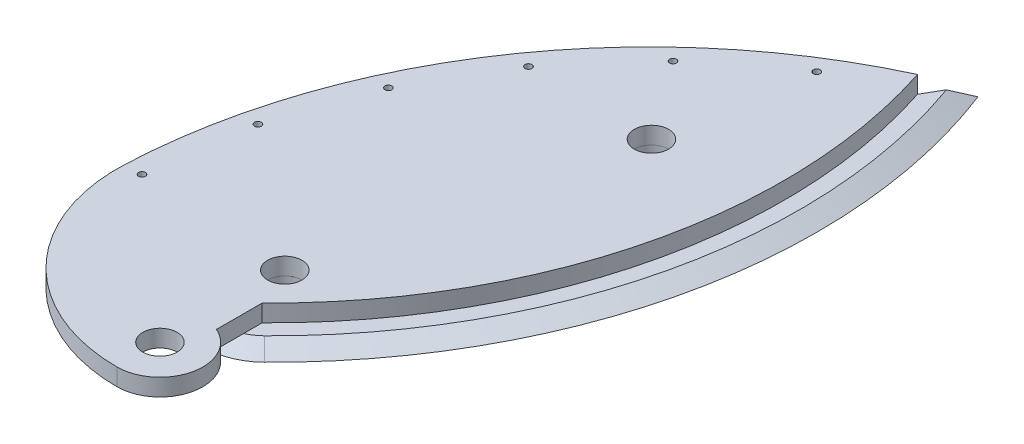
ISO-10303-21;
HEADER;
FILE_DESCRIPTION(('STEP AP214'),'2;1');
FILE_NAME('part.step','',(''),(''),'','','');
FILE_SCHEMA(('AUTOMOTIVE_DESIGN { 1 0 10303 214 1 1 1 1 }'));
ENDSEC;
DATA;
#1=APPLICATION_CONTEXT('core data for automotive mechanical design processes');
#2=APPLICATION_PROTOCOL_DEFINITION('international standard','automotive_design',2000,#1);
#3=PRODUCT_CONTEXT('',#1,'mechanical');
#4=PRODUCT('Part','Part','',(#3));
#5=PRODUCT_RELATED_PRODUCT_CATEGORY('part','',(#4));
#6=PRODUCT_DEFINITION_FORMATION('','',#4);
#7=PRODUCT_DEFINITION_CONTEXT('part definition',#1,'design');
#8=PRODUCT_DEFINITION('design','',#6,#7);
#9=PRODUCT_DEFINITION_SHAPE('','',#8);
#10=(LENGTH_UNIT() NAMED_UNIT(*) SI_UNIT(.MILLI.,.METRE.));
#11=(NAMED_UNIT(*) PLANE_ANGLE_UNIT() SI_UNIT($,.RADIAN.));
#12=(NAMED_UNIT(*) SI_UNIT($,.STERADIAN.) SOLID_ANGLE_UNIT());
#13=UNCERTAINTY_MEASURE_WITH_UNIT(LENGTH_MEASURE(1.E-05),#10,'distance_accuracy_value','');
#14=(GEOMETRIC_REPRESENTATION_CONTEXT(3) GLOBAL_UNCERTAINTY_ASSIGNED_CONTEXT((#13)) GLOBAL_UNIT_ASSIGNED_CONTEXT((#10,
#11,#12)) REPRESENTATION_CONTEXT('',''));
#15=CARTESIAN_POINT('',(0.,0.,0.));
#16=DIRECTION('',(0.,0.,1.));
#17=DIRECTION('',(1.,0.,0.));
#18=AXIS2_PLACEMENT_3D('',#15,#16,#17);
#19=CARTESIAN_POINT('',(0.,-3.,-36.3607275050168));
#20=DIRECTION('',(0.,1.,0.));
#21=DIRECTION('',(0.,0.,1.));
#22=AXIS2_PLACEMENT_3D('',#19,#20,#21);
#23=CYLINDRICAL_SURFACE('',#22,5.00000000000001);
#24=CARTESIAN_POINT('',(0.,-3.,-36.3607275050168));
#25=DIRECTION('',(0.,-1.,0.));
#26=DIRECTION('',(0.,0.,-1.));
#27=AXIS2_PLACEMENT_3D('',#24,#25,#26);
#28=CIRCLE('',#27,5.00000000000001);
#29=CARTESIAN_POINT('',(0.,-3.,-41.3607275050168));
#30=VERTEX_POINT('',#29);
#31=EDGE_CURVE('E121',#30,#30,#28,.F.);
#32=ORIENTED_EDGE('',*,*,#31,.F.);
#33=EDGE_LOOP('',(#32));
#34=FACE_BOUND('',#33,.T.);
#35=CARTESIAN_POINT('',(0.,0.,-36.3607275050168));
#36=DIRECTION('',(0.,-1.,0.));
#37=DIRECTION('',(0.,0.,-1.));
#38=AXIS2_PLACEMENT_3D('',#35,#36,#37);
#39=CIRCLE('',#38,5.00000000000001);
#40=CARTESIAN_POINT('',(0.,0.,-41.3607275050168));
#41=VERTEX_POINT('',#40);
#42=EDGE_CURVE('E129',#41,#41,#39,.F.);
#43=ORIENTED_EDGE('',*,*,#42,.T.);
#44=EDGE_LOOP('',(#43));
#45=FACE_BOUND('',#44,.T.);
#46=ADVANCED_FACE('F53',(#34,#45),#23,.F.);
#47=CARTESIAN_POINT('',(-44.9336347304744,-3.,-25.9424461073077));
#48=DIRECTION('',(-0.866025403784438,0.,-0.5));
#49=DIRECTION('',(-0.5,0.,0.866025403784439));
#50=AXIS2_PLACEMENT_3D('',#47,#48,#49);
#51=PLANE('',#50);
#52=DIRECTION('',(-0.5,0.,0.866025403784439));
#53=VECTOR('',#52,1.);
#54=CARTESIAN_POINT('',(-44.9336347304744,-3.,-25.9424461073077));
#55=LINE('',#54,#53);
#56=CARTESIAN_POINT('',(49.239635027576,-3.,-189.055334043141));
#57=VERTEX_POINT('',#56);
#58=CARTESIAN_POINT('',(-17.5,-3.,-73.4588952967756));
#59=VERTEX_POINT('',#58);
#60=EDGE_CURVE('E103',#57,#59,#55,.T.);
#61=ORIENTED_EDGE('',*,*,#60,.T.);
#62=DIRECTION('',(-0.480384461415261,-0.277350098112616,0.832050294337843));
#63=VECTOR('',#62,1.);
#64=CARTESIAN_POINT('',(-42.8233551358225,-17.6204459044517,-29.5975575834207));
#65=LINE('',#64,#63);
#66=CARTESIAN_POINT('',(-12.3038475772934,0.,-82.4588952967754));
#67=VERTEX_POINT('',#66);
#68=EDGE_CURVE('E140',#59,#67,#65,.F.);
#69=ORIENTED_EDGE('',*,*,#68,.T.);
#70=DIRECTION('',(-0.5,0.,0.866025403784439));
#71=VECTOR('',#70,1.);
#72=CARTESIAN_POINT('',(-44.9336347304744,0.,-25.9424461073077));
#73=LINE('',#72,#71);
#74=CARTESIAN_POINT('',(45.8658636185588,0.,-183.2117905496));
#75=VERTEX_POINT('',#74);
#76=EDGE_CURVE('E111',#75,#67,#73,.T.);
#77=ORIENTED_EDGE('',*,*,#76,.F.);
#78=CARTESIAN_POINT('',(45.8658636185588,0.,-183.2117905496));
#79=CARTESIAN_POINT('',(46.1475489587695,-0.247575260421279,-183.699683870592));
#80=CARTESIAN_POINT('',(46.4290959300721,-0.495780041105459,-184.187337529605));
#81=CARTESIAN_POINT('',(46.9919180548333,-0.993412526245764,-185.162174045315));
#82=CARTESIAN_POINT('',(47.273193209503,-1.24284022522252,-185.64935690411));
#83=CARTESIAN_POINT('',(47.8354790835258,-1.74288459465934,-186.623264606296));
#84=CARTESIAN_POINT('',(48.1164898029345,-1.9935012648688,-187.109989449783));
#85=CARTESIAN_POINT('',(48.6782540967055,-2.49589152411125,-188.082993748473));
#86=CARTESIAN_POINT('',(48.959007669911,-2.74766511831811,-188.569273201671));
#87=CARTESIAN_POINT('',(49.239635027576,-2.99999999999994,-189.055334043141));
#88=B_SPLINE_CURVE_WITH_KNOTS('',3,(#78,#79,#80,#81,#82,#83,#84,#85,#86,#87),.UNSPECIFIED.,.F.,
.F.,(4,2,2,2,4),(0.,1.84610899661148,3.69220972915079,5.53831007261421,7.38441868006475),.UNSPECIFIED.);
#89=EDGE_CURVE('E127',#75,#57,#88,.T.);
#90=ORIENTED_EDGE('',*,*,#89,.T.);
#91=EDGE_LOOP('',(#61,#69,#77,#90));
#92=FACE_BOUND('',#91,.T.);
#93=ADVANCED_FACE('F142',(#92),#51,.T.);
#94=CARTESIAN_POINT('',(20.3781666838312,-3.,-122.796020061503));
#95=DIRECTION('',(0.,1.,0.));
#96=DIRECTION('',(0.,0.,1.));
#97=AXIS2_PLACEMENT_3D('',#94,#95,#96);
#98=CYLINDRICAL_SURFACE('',#97,4.99999999999996);
#99=CARTESIAN_POINT('',(20.3781666838312,-3.,-122.796020061503));
#100=DIRECTION('',(0.,-1.,0.));
#101=DIRECTION('',(0.,0.,-1.));
#102=AXIS2_PLACEMENT_3D('',#99,#100,#101);
#103=CIRCLE('',#102,4.99999999999996);
#104=CARTESIAN_POINT('',(20.3781666838312,-3.,-127.796020061503));
#105=VERTEX_POINT('',#104);
#106=EDGE_CURVE('E124',#105,#105,#103,.F.);
#107=ORIENTED_EDGE('',*,*,#106,.F.);
#108=EDGE_LOOP('',(#107));
#109=FACE_BOUND('',#108,.T.);
#110=CARTESIAN_POINT('',(20.3781666838312,0.,-122.796020061503));
#111=DIRECTION('',(0.,-1.,0.));
#112=DIRECTION('',(0.,0.,-1.));
#113=AXIS2_PLACEMENT_3D('',#110,#111,#112);
#114=CIRCLE('',#113,4.99999999999996);
#115=CARTESIAN_POINT('',(20.3781666838312,0.,-127.796020061503));
#116=VERTEX_POINT('',#115);
#117=EDGE_CURVE('E106',#116,#116,#114,.F.);
#118=ORIENTED_EDGE('',*,*,#117,.T.);
#119=EDGE_LOOP('',(#118));
#120=FACE_BOUND('',#119,.T.);
#121=ADVANCED_FACE('F147',(#109,#120),#98,.F.);
#122=CARTESIAN_POINT('',(0.,-3.,0.));
#123=DIRECTION('',(0.,-1.,0.));
#124=DIRECTION('',(0.,0.,-1.));
#125=AXIS2_PLACEMENT_3D('',#122,#123,#124);
#126=PLANE('',#125);
#127=CARTESIAN_POINT('',(-99.0854388776051,-3.,-131.693438588004));
#128=DIRECTION('',(0.,-1.,0.));
#129=DIRECTION('',(0.,0.,-1.));
#130=AXIS2_PLACEMENT_3D('',#127,#128,#129);
#131=CIRCLE('',#130,159.030546119868);
#132=CARTESIAN_POINT('',(12.2517380727797,-3.,-18.1383963049683));
#133=VERTEX_POINT('',#132);
#134=EDGE_CURVE('E94',#133,#57,#131,.F.);
#135=ORIENTED_EDGE('',*,*,#134,.F.);
#136=CARTESIAN_POINT('',(0.,-3.,-30.6341921658169));
#137=DIRECTION('',(0.,-1.,0.));
#138=DIRECTION('',(0.,0.,-1.));
#139=AXIS2_PLACEMENT_3D('',#136,#137,#138);
#140=CIRCLE('',#139,17.5);
#141=CARTESIAN_POINT('',(-17.5,-3.,-30.6341921658169));
#142=VERTEX_POINT('',#141);
#143=EDGE_CURVE('E100',#133,#142,#140,.T.);
#144=ORIENTED_EDGE('',*,*,#143,.T.);
#145=DIRECTION('',(0.,0.,-1.));
#146=VECTOR('',#145,1.);
#147=CARTESIAN_POINT('',(-17.5,-3.,0.));
#148=LINE('',#147,#146);
#149=EDGE_CURVE('E116',#142,#59,#148,.T.);
#150=ORIENTED_EDGE('',*,*,#149,.T.);
#151=ORIENTED_EDGE('',*,*,#60,.F.);
#152=EDGE_LOOP('',(#135,#144,#150,#151));
#153=FACE_BOUND('',#152,.T.);
#154=ORIENTED_EDGE('',*,*,#31,.T.);
#155=EDGE_LOOP('',(#154));
#156=FACE_BOUND('',#155,.T.);
#157=ORIENTED_EDGE('',*,*,#106,.T.);
#158=EDGE_LOOP('',(#157));
#159=FACE_BOUND('',#158,.T.);
#160=ADVANCED_FACE('F96',(#153,#156,#159),#126,.T.);
#161=CARTESIAN_POINT('',(0.,0.,0.));
#162=DIRECTION('',(0.,-1.,0.));
#163=DIRECTION('',(0.,0.,-1.));
#164=AXIS2_PLACEMENT_3D('',#161,#162,#163);
#165=PLANE('',#164);
#166=ORIENTED_EDGE('',*,*,#76,.T.);
#167=DIRECTION('',(0.,0.,1.));
#168=VECTOR('',#167,1.);
#169=CARTESIAN_POINT('',(-12.3038475772935,0.,0.));
#170=LINE('',#169,#168);
#171=CARTESIAN_POINT('',(-12.3038475772935,0.,-30.6341921658169));
#172=VERTEX_POINT('',#171);
#173=EDGE_CURVE('E12',#67,#172,#170,.T.);
#174=ORIENTED_EDGE('',*,*,#173,.T.);
#175=CARTESIAN_POINT('',(0.,0.,-30.6341921658169));
#176=DIRECTION('',(0.,-1.,0.));
#177=DIRECTION('',(0.,0.,-1.));
#178=AXIS2_PLACEMENT_3D('',#175,#176,#177);
#179=CIRCLE('',#178,12.3038475772935);
#180=CARTESIAN_POINT('',(8.61391530310883,0.,-21.848685444168));
#181=VERTEX_POINT('',#180);
#182=EDGE_CURVE('E64',#172,#181,#179,.F.);
#183=ORIENTED_EDGE('',*,*,#182,.T.);
#184=CARTESIAN_POINT('',(-99.0854388776051,0.,-131.693438588004));
#185=DIRECTION('',(0.,-1.,0.));
#186=DIRECTION('',(0.,0.,-1.));
#187=AXIS2_PLACEMENT_3D('',#184,#185,#186);
#188=CIRCLE('',#187,153.834393697161);
#189=EDGE_CURVE('E109',#181,#75,#188,.F.);
#190=ORIENTED_EDGE('',*,*,#189,.T.);
#191=EDGE_LOOP('',(#166,#174,#183,#190));
#192=FACE_BOUND('',#191,.T.);
#193=ORIENTED_EDGE('',*,*,#42,.F.);
#194=EDGE_LOOP('',(#193));
#195=FACE_BOUND('',#194,.T.);
#196=ORIENTED_EDGE('',*,*,#117,.F.);
#197=EDGE_LOOP('',(#196));
#198=FACE_BOUND('',#197,.T.);
#199=ADVANCED_FACE('F163',(#192,#195,#198),#165,.F.);
#200=CARTESIAN_POINT('',(-99.0854388776051,0.,-131.693438588004));
#201=DIRECTION('',(0.,-1.,0.));
#202=DIRECTION('',(0.,0.,-1.));
#203=AXIS2_PLACEMENT_3D('',#200,#201,#202);
#204=CONICAL_SURFACE('',#203,153.834393697161,1.0471975511966);
#205=ORIENTED_EDGE('',*,*,#89,.F.);
#206=ORIENTED_EDGE('',*,*,#189,.F.);
#207=DIRECTION('',(-0.606303794945155,0.500000000000001,-0.61838152319996));
#208=VECTOR('',#207,1.);
#209=CARTESIAN_POINT('',(12.2517380727797,-2.99999999999996,-18.1383963049683));
#210=LINE('',#209,#208);
#211=EDGE_CURVE('E59',#133,#181,#210,.T.);
#212=ORIENTED_EDGE('',*,*,#211,.F.);
#213=ORIENTED_EDGE('',*,*,#134,.T.);
#214=EDGE_LOOP('',(#205,#206,#212,#213));
#215=FACE_BOUND('',#214,.T.);
#216=ADVANCED_FACE('F56',(#215),#204,.T.);
#217=CARTESIAN_POINT('',(0.,-2.99999999999996,-30.6341921658169));
#218=DIRECTION('',(0.,-1.,0.));
#219=DIRECTION('',(0.,0.,-1.));
#220=AXIS2_PLACEMENT_3D('',#217,#218,#219);
#221=CONICAL_SURFACE('',#220,17.5,1.0471975511966);
#222=ORIENTED_EDGE('',*,*,#211,.T.);
#223=ORIENTED_EDGE('',*,*,#182,.F.);
#224=DIRECTION('',(0.866025403784438,0.500000000000002,0.));
#225=VECTOR('',#224,1.);
#226=CARTESIAN_POINT('',(-17.5,-2.99999999999996,-30.6341921658169));
#227=LINE('',#226,#225);
#228=EDGE_CURVE('E112',#142,#172,#227,.T.);
#229=ORIENTED_EDGE('',*,*,#228,.F.);
#230=ORIENTED_EDGE('',*,*,#143,.F.);
#231=EDGE_LOOP('',(#222,#223,#229,#230));
#232=FACE_BOUND('',#231,.T.);
#233=ADVANCED_FACE('F113',(#232),#221,.T.);
#234=CARTESIAN_POINT('',(-17.5,-2.99999999999996,0.));
#235=DIRECTION('',(0.500000000000002,-0.866025403784438,0.));
#236=DIRECTION('',(0.,0.,-1.));
#237=AXIS2_PLACEMENT_3D('',#234,#235,#236);
#238=PLANE('',#237);
#239=ORIENTED_EDGE('',*,*,#228,.T.);
#240=ORIENTED_EDGE('',*,*,#173,.F.);
#241=ORIENTED_EDGE('',*,*,#68,.F.);
#242=ORIENTED_EDGE('',*,*,#149,.F.);
#243=EDGE_LOOP('',(#239,#240,#241,#242));
#244=FACE_BOUND('',#243,.T.);
#245=ADVANCED_FACE('F151',(#244),#238,.F.);
#246=CLOSED_SHELL('',(#46,#93,#121,#160,#199,#216,#233,#245));
#247=MANIFOLD_SOLID_BREP('B2',#246);
#248=CARTESIAN_POINT('',(109.8923327433,5.,-32.6342827624353));
#249=DIRECTION('',(0.,-1.,0.));
#250=DIRECTION('',(0.,0.,-1.));
#251=AXIS2_PLACEMENT_3D('',#248,#249,#250);
#252=CYLINDRICAL_SURFACE('',#251,160.);
#253=CARTESIAN_POINT('',(109.8923327433,0.,-32.6342827624353));
#254=DIRECTION('',(0.,1.,0.));
#255=DIRECTION('',(0.,0.,1.));
#256=AXIS2_PLACEMENT_3D('',#253,#254,#255);
#257=CIRCLE('',#256,160.);
#258=CARTESIAN_POINT('',(42.7892608894871,0.,-177.882958308142));
#259=VERTEX_POINT('',#258);
#260=CARTESIAN_POINT('',(-49.9510603378634,0.,-39.7116896534385));
#261=VERTEX_POINT('',#260);
#262=EDGE_CURVE('E359',#259,#261,#257,.T.);
#263=ORIENTED_EDGE('',*,*,#262,.T.);
#264=DIRECTION('',(0.,-1.,0.));
#265=VECTOR('',#264,1.);
#266=CARTESIAN_POINT('',(-49.9510603378634,5.,-39.7116896534385));
#267=LINE('',#266,#265);
#268=CARTESIAN_POINT('',(-49.9510603378634,5.,-39.7116896534385));
#269=VERTEX_POINT('',#268);
#270=EDGE_CURVE('E51',#269,#261,#267,.T.);
#271=ORIENTED_EDGE('',*,*,#270,.F.);
#272=CARTESIAN_POINT('',(109.8923327433,5.,-32.6342827624353));
#273=DIRECTION('',(0.,1.,0.));
#274=DIRECTION('',(0.,0.,1.));
#275=AXIS2_PLACEMENT_3D('',#272,#273,#274);
#276=CIRCLE('',#275,160.);
#277=CARTESIAN_POINT('',(42.7892608894871,5.,-177.882958308142));
#278=VERTEX_POINT('',#277);
#279=EDGE_CURVE('E629',#278,#269,#276,.T.);
#280=ORIENTED_EDGE('',*,*,#279,.F.);
#281=DIRECTION('',(0.,-1.,0.));
#282=VECTOR('',#281,1.);
#283=CARTESIAN_POINT('',(42.7892608894871,5.,-177.882958308142));
#284=LINE('',#283,#282);
#285=EDGE_CURVE('E290',#278,#259,#284,.T.);
#286=ORIENTED_EDGE('',*,*,#285,.T.);
#287=EDGE_LOOP('',(#263,#271,#280,#286));
#288=FACE_BOUND('',#287,.T.);
#289=ADVANCED_FACE('F271',(#288),#252,.T.);
#290=CARTESIAN_POINT('',(0.,5.,-37.5));
#291=DIRECTION('',(0.,-1.,0.));
#292=DIRECTION('',(0.,0.,-1.));
#293=AXIS2_PLACEMENT_3D('',#290,#291,#292);
#294=CYLINDRICAL_SURFACE('',#293,50.);
#295=CARTESIAN_POINT('',(0.,0.,-37.5));
#296=DIRECTION('',(0.,1.,0.));
#297=DIRECTION('',(0.,0.,1.));
#298=AXIS2_PLACEMENT_3D('',#295,#296,#297);
#299=CIRCLE('',#298,50.);
#300=CARTESIAN_POINT('',(0.,0.,12.5));
#301=VERTEX_POINT('',#300);
#302=EDGE_CURVE('E361',#261,#301,#299,.T.);
#303=ORIENTED_EDGE('',*,*,#302,.T.);
#304=DIRECTION('',(0.,-1.,0.));
#305=VECTOR('',#304,1.);
#306=CARTESIAN_POINT('',(0.,5.,12.5));
#307=LINE('',#306,#305);
#308=CARTESIAN_POINT('',(0.,5.,12.5));
#309=VERTEX_POINT('',#308);
#310=EDGE_CURVE('E281',#309,#301,#307,.T.);
#311=ORIENTED_EDGE('',*,*,#310,.F.);
#312=CARTESIAN_POINT('',(0.,5.,-37.5));
#313=DIRECTION('',(0.,1.,0.));
#314=DIRECTION('',(0.,0.,1.));
#315=AXIS2_PLACEMENT_3D('',#312,#313,#314);
#316=CIRCLE('',#315,50.);
#317=EDGE_CURVE('E319',#269,#309,#316,.T.);
#318=ORIENTED_EDGE('',*,*,#317,.F.);
#319=ORIENTED_EDGE('',*,*,#270,.T.);
#320=EDGE_LOOP('',(#303,#311,#318,#319));
#321=FACE_BOUND('',#320,.T.);
#322=ADVANCED_FACE('F410',(#321),#294,.T.);
#323=CARTESIAN_POINT('',(0.,5.,0.));
#324=DIRECTION('',(0.,-1.,0.));
#325=DIRECTION('',(0.,0.,-1.));
#326=AXIS2_PLACEMENT_3D('',#323,#324,#325);
#327=CYLINDRICAL_SURFACE('',#326,12.5);
#328=CARTESIAN_POINT('',(0.,0.,0.));
#329=DIRECTION('',(0.,1.,0.));
#330=DIRECTION('',(0.,0.,1.));
#331=AXIS2_PLACEMENT_3D('',#328,#329,#330);
#332=CIRCLE('',#331,12.5);
#333=CARTESIAN_POINT('',(5.,0.,-11.4564392373896));
#334=VERTEX_POINT('',#333);
#335=EDGE_CURVE('E340',#301,#334,#332,.T.);
#336=ORIENTED_EDGE('',*,*,#335,.T.);
#337=DIRECTION('',(0.,-1.,0.));
#338=VECTOR('',#337,1.);
#339=CARTESIAN_POINT('',(5.,5.,-11.4564392373896));
#340=LINE('',#339,#338);
#341=CARTESIAN_POINT('',(5.,5.,-11.4564392373896));
#342=VERTEX_POINT('',#341);
#343=EDGE_CURVE('E337',#342,#334,#340,.T.);
#344=ORIENTED_EDGE('',*,*,#343,.F.);
#345=CARTESIAN_POINT('',(0.,5.,0.));
#346=DIRECTION('',(0.,1.,0.));
#347=DIRECTION('',(0.,0.,1.));
#348=AXIS2_PLACEMENT_3D('',#345,#346,#347);
#349=CIRCLE('',#348,12.5);
#350=EDGE_CURVE('E326',#309,#342,#349,.T.);
#351=ORIENTED_EDGE('',*,*,#350,.F.);
#352=ORIENTED_EDGE('',*,*,#310,.T.);
#353=EDGE_LOOP('',(#336,#344,#351,#352));
#354=FACE_BOUND('',#353,.T.);
#355=ADVANCED_FACE('F338',(#354),#327,.T.);
#356=CARTESIAN_POINT('',(5.,5.,0.));
#357=DIRECTION('',(1.,0.,0.));
#358=DIRECTION('',(0.,0.,-1.));
#359=AXIS2_PLACEMENT_3D('',#356,#357,#358);
#360=PLANE('',#359);
#361=DIRECTION('',(0.,0.,1.));
#362=VECTOR('',#361,1.);
#363=CARTESIAN_POINT('',(5.,0.,0.));
#364=LINE('',#363,#362);
#365=CARTESIAN_POINT('',(5.,0.,-24.7910364651527));
#366=VERTEX_POINT('',#365);
#367=EDGE_CURVE('E364',#366,#334,#364,.T.);
#368=ORIENTED_EDGE('',*,*,#367,.F.);
#369=DIRECTION('',(0.,-1.,0.));
#370=VECTOR('',#369,1.);
#371=CARTESIAN_POINT('',(5.,5.,-24.7910364651527));
#372=LINE('',#371,#370);
#373=CARTESIAN_POINT('',(5.,5.,-24.7910364651527));
#374=VERTEX_POINT('',#373);
#375=EDGE_CURVE('E307',#374,#366,#372,.T.);
#376=ORIENTED_EDGE('',*,*,#375,.F.);
#377=DIRECTION('',(0.,0.,1.));
#378=VECTOR('',#377,1.);
#379=CARTESIAN_POINT('',(5.,5.,0.));
#380=LINE('',#379,#378);
#381=EDGE_CURVE('E332',#374,#342,#380,.T.);
#382=ORIENTED_EDGE('',*,*,#381,.T.);
#383=ORIENTED_EDGE('',*,*,#343,.T.);
#384=EDGE_LOOP('',(#368,#376,#382,#383));
#385=FACE_BOUND('',#384,.T.);
#386=ADVANCED_FACE('F344',(#385),#360,.T.);
#387=CARTESIAN_POINT('',(-99.0854388776051,5.,-131.693438588004));
#388=DIRECTION('',(0.,-1.,0.));
#389=DIRECTION('',(0.,0.,-1.));
#390=AXIS2_PLACEMENT_3D('',#387,#388,#389);
#391=CYLINDRICAL_SURFACE('',#390,149.204229718797);
#392=CARTESIAN_POINT('',(-99.0854388776051,0.,-131.693438588004));
#393=DIRECTION('',(0.,1.,0.));
#394=DIRECTION('',(0.,0.,1.));
#395=AXIS2_PLACEMENT_3D('',#392,#393,#394);
#396=CIRCLE('',#395,149.204229718797);
#397=EDGE_CURVE('E366',#259,#366,#396,.F.);
#398=ORIENTED_EDGE('',*,*,#397,.F.);
#399=ORIENTED_EDGE('',*,*,#285,.F.);
#400=CARTESIAN_POINT('',(-99.0854388776051,5.,-131.693438588004));
#401=DIRECTION('',(0.,1.,0.));
#402=DIRECTION('',(0.,0.,1.));
#403=AXIS2_PLACEMENT_3D('',#400,#401,#402);
#404=CIRCLE('',#403,149.204229718797);
#405=EDGE_CURVE('E345',#278,#374,#404,.F.);
#406=ORIENTED_EDGE('',*,*,#405,.T.);
#407=ORIENTED_EDGE('',*,*,#375,.T.);
#408=EDGE_LOOP('',(#398,#399,#406,#407));
#409=FACE_BOUND('',#408,.T.);
#410=ADVANCED_FACE('F419',(#409),#391,.T.);
#411=CARTESIAN_POINT('',(20.3781666838312,5.,-122.796020061503));
#412=DIRECTION('',(0.,-1.,0.));
#413=DIRECTION('',(0.,0.,-1.));
#414=AXIS2_PLACEMENT_3D('',#411,#412,#413);
#415=CYLINDRICAL_SURFACE('',#414,4.99999999999996);
#416=CARTESIAN_POINT('',(20.3781666838312,5.,-122.796020061503));
#417=DIRECTION('',(0.,1.,0.));
#418=DIRECTION('',(0.,0.,1.));
#419=AXIS2_PLACEMENT_3D('',#416,#417,#418);
#420=CIRCLE('',#419,4.99999999999996);
#421=CARTESIAN_POINT('',(20.3781666838312,5.,-117.796020061503));
#422=VERTEX_POINT('',#421);
#423=EDGE_CURVE('E431',#422,#422,#420,.T.);
#424=ORIENTED_EDGE('',*,*,#423,.T.);
#425=EDGE_LOOP('',(#424));
#426=FACE_BOUND('',#425,.T.);
#427=CARTESIAN_POINT('',(20.3781666838312,0.,-122.796020061503));
#428=DIRECTION('',(0.,1.,0.));
#429=DIRECTION('',(0.,0.,1.));
#430=AXIS2_PLACEMENT_3D('',#427,#428,#429);
#431=CIRCLE('',#430,4.99999999999996);
#432=CARTESIAN_POINT('',(20.3781666838312,0.,-117.796020061503));
#433=VERTEX_POINT('',#432);
#434=EDGE_CURVE('E356',#433,#433,#431,.T.);
#435=ORIENTED_EDGE('',*,*,#434,.F.);
#436=EDGE_LOOP('',(#435));
#437=FACE_BOUND('',#436,.T.);
#438=ADVANCED_FACE('F417',(#426,#437),#415,.F.);
#439=CARTESIAN_POINT('',(0.,5.,-36.3607275050168));
#440=DIRECTION('',(0.,-1.,0.));
#441=DIRECTION('',(0.,0.,-1.));
#442=AXIS2_PLACEMENT_3D('',#439,#440,#441);
#443=CYLINDRICAL_SURFACE('',#442,5.00000000000001);
#444=CARTESIAN_POINT('',(0.,5.,-36.3607275050168));
#445=DIRECTION('',(0.,1.,0.));
#446=DIRECTION('',(0.,0.,1.));
#447=AXIS2_PLACEMENT_3D('',#444,#445,#446);
#448=CIRCLE('',#447,5.00000000000001);
#449=CARTESIAN_POINT('',(0.,5.,-31.3607275050168));
#450=VERTEX_POINT('',#449);
#451=EDGE_CURVE('E372',#450,#450,#448,.T.);
#452=ORIENTED_EDGE('',*,*,#451,.T.);
#453=EDGE_LOOP('',(#452));
#454=FACE_BOUND('',#453,.T.);
#455=CARTESIAN_POINT('',(0.,0.,-36.3607275050168));
#456=DIRECTION('',(0.,1.,0.));
#457=DIRECTION('',(0.,0.,1.));
#458=AXIS2_PLACEMENT_3D('',#455,#456,#457);
#459=CIRCLE('',#458,5.00000000000001);
#460=CARTESIAN_POINT('',(0.,0.,-31.3607275050168));
#461=VERTEX_POINT('',#460);
#462=EDGE_CURVE('E353',#461,#461,#459,.T.);
#463=ORIENTED_EDGE('',*,*,#462,.F.);
#464=EDGE_LOOP('',(#463));
#465=FACE_BOUND('',#464,.T.);
#466=ADVANCED_FACE('F273',(#454,#465),#443,.F.);
#467=CARTESIAN_POINT('',(0.,5.,0.));
#468=DIRECTION('',(0.,-1.,0.));
#469=DIRECTION('',(0.,0.,-1.));
#470=AXIS2_PLACEMENT_3D('',#467,#468,#469);
#471=CYLINDRICAL_SURFACE('',#470,5.);
#472=CARTESIAN_POINT('',(0.,5.,0.));
#473=DIRECTION('',(0.,1.,0.));
#474=DIRECTION('',(0.,0.,1.));
#475=AXIS2_PLACEMENT_3D('',#472,#473,#474);
#476=CIRCLE('',#475,5.);
#477=CARTESIAN_POINT('',(0.,5.,5.));
#478=VERTEX_POINT('',#477);
#479=EDGE_CURVE('E347',#478,#478,#476,.T.);
#480=ORIENTED_EDGE('',*,*,#479,.T.);
#481=EDGE_LOOP('',(#480));
#482=FACE_BOUND('',#481,.T.);
#483=CARTESIAN_POINT('',(0.,0.,0.));
#484=DIRECTION('',(0.,1.,0.));
#485=DIRECTION('',(0.,0.,1.));
#486=AXIS2_PLACEMENT_3D('',#483,#484,#485);
#487=CIRCLE('',#486,5.);
#488=CARTESIAN_POINT('',(0.,0.,5.));
#489=VERTEX_POINT('',#488);
#490=EDGE_CURVE('E369',#489,#489,#487,.T.);
#491=ORIENTED_EDGE('',*,*,#490,.F.);
#492=EDGE_LOOP('',(#491));
#493=FACE_BOUND('',#492,.T.);
#494=ADVANCED_FACE('F425',(#482,#493),#471,.F.);
#495=CARTESIAN_POINT('',(0.,5.,0.));
#496=DIRECTION('',(0.,1.,0.));
#497=DIRECTION('',(0.,0.,1.));
#498=AXIS2_PLACEMENT_3D('',#495,#496,#497);
#499=PLANE('',#498);
#500=CARTESIAN_POINT('',(27.4308445902593,5.,-163.878722536416));
#501=DIRECTION('',(0.,1.,0.));
#502=DIRECTION('',(0.,0.,1.));
#503=AXIS2_PLACEMENT_3D('',#500,#501,#502);
#504=CIRCLE('',#503,0.999999999999354);
#505=CARTESIAN_POINT('',(27.4308445902593,5.,-162.878722536416));
#506=VERTEX_POINT('',#505);
#507=EDGE_CURVE('E380',#506,#506,#504,.T.);
#508=ORIENTED_EDGE('',*,*,#507,.F.);
#509=EDGE_LOOP('',(#508));
#510=FACE_BOUND('',#509,.T.);
#511=CARTESIAN_POINT('',(3.80793571220837,5.,-145.64357754189));
#512=DIRECTION('',(0.,1.,0.));
#513=DIRECTION('',(0.,0.,1.));
#514=AXIS2_PLACEMENT_3D('',#511,#512,#513);
#515=CIRCLE('',#514,0.999999999999519);
#516=CARTESIAN_POINT('',(3.80793571220837,5.,-144.643577541891));
#517=VERTEX_POINT('',#516);
#518=EDGE_CURVE('E611',#517,#517,#515,.T.);
#519=ORIENTED_EDGE('',*,*,#518,.F.);
#520=EDGE_LOOP('',(#519));
#521=FACE_BOUND('',#520,.T.);
#522=CARTESIAN_POINT('',(-15.8826206779579,5.,-123.219386901474));
#523=DIRECTION('',(0.,1.,0.));
#524=DIRECTION('',(0.,0.,1.));
#525=AXIS2_PLACEMENT_3D('',#522,#523,#524);
#526=CIRCLE('',#525,1.);
#527=CARTESIAN_POINT('',(-15.8826206779579,5.,-122.219386901474));
#528=VERTEX_POINT('',#527);
#529=EDGE_CURVE('E595',#528,#528,#526,.T.);
#530=ORIENTED_EDGE('',*,*,#529,.F.);
#531=EDGE_LOOP('',(#530));
#532=FACE_BOUND('',#531,.T.);
#533=CARTESIAN_POINT('',(-30.9109320552719,5.,-97.4373739083318));
#534=DIRECTION('',(0.,1.,0.));
#535=DIRECTION('',(0.,0.,1.));
#536=AXIS2_PLACEMENT_3D('',#533,#534,#535);
#537=CIRCLE('',#536,0.999999999999998);
#538=CARTESIAN_POINT('',(-30.9109320552719,5.,-96.4373739083318));
#539=VERTEX_POINT('',#538);
#540=EDGE_CURVE('E612',#539,#539,#537,.T.);
#541=ORIENTED_EDGE('',*,*,#540,.F.);
#542=EDGE_LOOP('',(#541));
#543=FACE_BOUND('',#542,.T.);
#544=CARTESIAN_POINT('',(-40.7199266986587,5.,-69.2532301228968));
#545=DIRECTION('',(0.,1.,0.));
#546=DIRECTION('',(0.,0.,1.));
#547=AXIS2_PLACEMENT_3D('',#544,#545,#546);
#548=CIRCLE('',#547,0.999999999999998);
#549=CARTESIAN_POINT('',(-40.7199266986587,5.,-68.2532301228968));
#550=VERTEX_POINT('',#549);
#551=EDGE_CURVE('E617',#550,#550,#548,.T.);
#552=ORIENTED_EDGE('',*,*,#551,.F.);
#553=EDGE_LOOP('',(#552));
#554=FACE_BOUND('',#553,.T.);
#555=CARTESIAN_POINT('',(-44.9460033098213,5.,-39.7116896534385));
#556=DIRECTION('',(0.,1.,0.));
#557=DIRECTION('',(0.,0.,1.));
#558=AXIS2_PLACEMENT_3D('',#555,#556,#557);
#559=CIRCLE('',#558,0.999999999999983);
#560=CARTESIAN_POINT('',(-44.9460033098213,5.,-38.7116896534385));
#561=VERTEX_POINT('',#560);
#562=EDGE_CURVE('E623',#561,#561,#559,.T.);
#563=ORIENTED_EDGE('',*,*,#562,.F.);
#564=EDGE_LOOP('',(#563));
#565=FACE_BOUND('',#564,.T.);
#566=ORIENTED_EDGE('',*,*,#451,.F.);
#567=EDGE_LOOP('',(#566));
#568=FACE_BOUND('',#567,.T.);
#569=ORIENTED_EDGE('',*,*,#423,.F.);
#570=EDGE_LOOP('',(#569));
#571=FACE_BOUND('',#570,.T.);
#572=ORIENTED_EDGE('',*,*,#279,.T.);
#573=ORIENTED_EDGE('',*,*,#317,.T.);
#574=ORIENTED_EDGE('',*,*,#350,.T.);
#575=ORIENTED_EDGE('',*,*,#381,.F.);
#576=ORIENTED_EDGE('',*,*,#405,.F.);
#577=EDGE_LOOP('',(#572,#573,#574,#575,#576));
#578=FACE_BOUND('',#577,.T.);
#579=ORIENTED_EDGE('',*,*,#479,.F.);
#580=EDGE_LOOP('',(#579));
#581=FACE_BOUND('',#580,.T.);
#582=ADVANCED_FACE('F328',(#510,#521,#532,#543,#554,#565,#568,#571,#578,#581),#499,.T.);
#583=CARTESIAN_POINT('',(0.,0.,0.));
#584=DIRECTION('',(0.,1.,0.));
#585=DIRECTION('',(0.,0.,1.));
#586=AXIS2_PLACEMENT_3D('',#583,#584,#585);
#587=PLANE('',#586);
#588=CARTESIAN_POINT('',(27.4308445902593,0.,-163.878722536416));
#589=DIRECTION('',(0.,1.,0.));
#590=DIRECTION('',(0.,0.,1.));
#591=AXIS2_PLACEMENT_3D('',#588,#589,#590);
#592=CIRCLE('',#591,0.999999999999354);
#593=CARTESIAN_POINT('',(27.4308445902593,0.,-162.878722536416));
#594=VERTEX_POINT('',#593);
#595=EDGE_CURVE('E275',#594,#594,#592,.T.);
#596=ORIENTED_EDGE('',*,*,#595,.T.);
#597=EDGE_LOOP('',(#596));
#598=FACE_BOUND('',#597,.T.);
#599=CARTESIAN_POINT('',(3.80793571220837,0.,-145.64357754189));
#600=DIRECTION('',(0.,1.,0.));
#601=DIRECTION('',(0.,0.,1.));
#602=AXIS2_PLACEMENT_3D('',#599,#600,#601);
#603=CIRCLE('',#602,0.999999999999519);
#604=CARTESIAN_POINT('',(3.80793571220837,0.,-144.643577541891));
#605=VERTEX_POINT('',#604);
#606=EDGE_CURVE('E388',#605,#605,#603,.T.);
#607=ORIENTED_EDGE('',*,*,#606,.T.);
#608=EDGE_LOOP('',(#607));
#609=FACE_BOUND('',#608,.T.);
#610=CARTESIAN_POINT('',(-15.8826206779579,0.,-123.219386901474));
#611=DIRECTION('',(0.,1.,0.));
#612=DIRECTION('',(0.,0.,1.));
#613=AXIS2_PLACEMENT_3D('',#610,#611,#612);
#614=CIRCLE('',#613,1.);
#615=CARTESIAN_POINT('',(-15.8826206779579,0.,-122.219386901474));
#616=VERTEX_POINT('',#615);
#617=EDGE_CURVE('E386',#616,#616,#614,.T.);
#618=ORIENTED_EDGE('',*,*,#617,.T.);
#619=EDGE_LOOP('',(#618));
#620=FACE_BOUND('',#619,.T.);
#621=CARTESIAN_POINT('',(-30.9109320552719,0.,-97.4373739083318));
#622=DIRECTION('',(0.,1.,0.));
#623=DIRECTION('',(0.,0.,1.));
#624=AXIS2_PLACEMENT_3D('',#621,#622,#623);
#625=CIRCLE('',#624,0.999999999999998);
#626=CARTESIAN_POINT('',(-30.9109320552719,0.,-96.4373739083318));
#627=VERTEX_POINT('',#626);
#628=EDGE_CURVE('E383',#627,#627,#625,.T.);
#629=ORIENTED_EDGE('',*,*,#628,.T.);
#630=EDGE_LOOP('',(#629));
#631=FACE_BOUND('',#630,.T.);
#632=CARTESIAN_POINT('',(-40.7199266986587,0.,-69.2532301228968));
#633=DIRECTION('',(0.,1.,0.));
#634=DIRECTION('',(0.,0.,1.));
#635=AXIS2_PLACEMENT_3D('',#632,#633,#634);
#636=CIRCLE('',#635,0.999999999999998);
#637=CARTESIAN_POINT('',(-40.7199266986587,0.,-68.2532301228968));
#638=VERTEX_POINT('',#637);
#639=EDGE_CURVE('E379',#638,#638,#636,.T.);
#640=ORIENTED_EDGE('',*,*,#639,.T.);
#641=EDGE_LOOP('',(#640));
#642=FACE_BOUND('',#641,.T.);
#643=CARTESIAN_POINT('',(-44.9460033098213,0.,-39.7116896534385));
#644=DIRECTION('',(0.,1.,0.));
#645=DIRECTION('',(0.,0.,1.));
#646=AXIS2_PLACEMENT_3D('',#643,#644,#645);
#647=CIRCLE('',#646,0.999999999999983);
#648=CARTESIAN_POINT('',(-44.9460033098213,0.,-38.7116896534385));
#649=VERTEX_POINT('',#648);
#650=EDGE_CURVE('E376',#649,#649,#647,.T.);
#651=ORIENTED_EDGE('',*,*,#650,.T.);
#652=EDGE_LOOP('',(#651));
#653=FACE_BOUND('',#652,.T.);
#654=ORIENTED_EDGE('',*,*,#462,.T.);
#655=EDGE_LOOP('',(#654));
#656=FACE_BOUND('',#655,.T.);
#657=ORIENTED_EDGE('',*,*,#434,.T.);
#658=EDGE_LOOP('',(#657));
#659=FACE_BOUND('',#658,.T.);
#660=ORIENTED_EDGE('',*,*,#262,.F.);
#661=ORIENTED_EDGE('',*,*,#397,.T.);
#662=ORIENTED_EDGE('',*,*,#367,.T.);
#663=ORIENTED_EDGE('',*,*,#335,.F.);
#664=ORIENTED_EDGE('',*,*,#302,.F.);
#665=EDGE_LOOP('',(#660,#661,#662,#663,#664));
#666=FACE_BOUND('',#665,.T.);
#667=ORIENTED_EDGE('',*,*,#490,.T.);
#668=EDGE_LOOP('',(#667));
#669=FACE_BOUND('',#668,.T.);
#670=ADVANCED_FACE('F395',(#598,#609,#620,#631,#642,#653,#656,#659,#666,#669),#587,.F.);
#671=CARTESIAN_POINT('',(-44.9460033098213,-3.,-39.7116896534385));
#672=DIRECTION('',(0.,1.,0.));
#673=DIRECTION('',(0.,0.,1.));
#674=AXIS2_PLACEMENT_3D('',#671,#672,#673);
#675=CYLINDRICAL_SURFACE('',#674,0.999999999999983);
#676=ORIENTED_EDGE('',*,*,#562,.T.);
#677=EDGE_LOOP('',(#676));
#678=FACE_BOUND('',#677,.T.);
#679=ORIENTED_EDGE('',*,*,#650,.F.);
#680=EDGE_LOOP('',(#679));
#681=FACE_BOUND('',#680,.T.);
#682=ADVANCED_FACE('F436',(#678,#681),#675,.F.);
#683=CARTESIAN_POINT('',(-40.7199266986587,-3.,-69.2532301228968));
#684=DIRECTION('',(0.,1.,0.));
#685=DIRECTION('',(0.,0.,1.));
#686=AXIS2_PLACEMENT_3D('',#683,#684,#685);
#687=CYLINDRICAL_SURFACE('',#686,0.999999999999998);
#688=ORIENTED_EDGE('',*,*,#551,.T.);
#689=EDGE_LOOP('',(#688));
#690=FACE_BOUND('',#689,.T.);
#691=ORIENTED_EDGE('',*,*,#639,.F.);
#692=EDGE_LOOP('',(#691));
#693=FACE_BOUND('',#692,.T.);
#694=ADVANCED_FACE('F505',(#690,#693),#687,.F.);
#695=CARTESIAN_POINT('',(-30.9109320552719,-3.,-97.4373739083318));
#696=DIRECTION('',(0.,1.,0.));
#697=DIRECTION('',(0.,0.,1.));
#698=AXIS2_PLACEMENT_3D('',#695,#696,#697);
#699=CYLINDRICAL_SURFACE('',#698,0.999999999999998);
#700=ORIENTED_EDGE('',*,*,#540,.T.);
#701=EDGE_LOOP('',(#700));
#702=FACE_BOUND('',#701,.T.);
#703=ORIENTED_EDGE('',*,*,#628,.F.);
#704=EDGE_LOOP('',(#703));
#705=FACE_BOUND('',#704,.T.);
#706=ADVANCED_FACE('F516',(#702,#705),#699,.F.);
#707=CARTESIAN_POINT('',(-15.8826206779579,-3.,-123.219386901474));
#708=DIRECTION('',(0.,1.,0.));
#709=DIRECTION('',(0.,0.,1.));
#710=AXIS2_PLACEMENT_3D('',#707,#708,#709);
#711=CYLINDRICAL_SURFACE('',#710,1.);
#712=ORIENTED_EDGE('',*,*,#529,.T.);
#713=EDGE_LOOP('',(#712));
#714=FACE_BOUND('',#713,.T.);
#715=ORIENTED_EDGE('',*,*,#617,.F.);
#716=EDGE_LOOP('',(#715));
#717=FACE_BOUND('',#716,.T.);
#718=ADVANCED_FACE('F405',(#714,#717),#711,.F.);
#719=CARTESIAN_POINT('',(3.80793571220837,-3.,-145.64357754189));
#720=DIRECTION('',(0.,1.,0.));
#721=DIRECTION('',(0.,0.,1.));
#722=AXIS2_PLACEMENT_3D('',#719,#720,#721);
#723=CYLINDRICAL_SURFACE('',#722,0.999999999999519);
#724=ORIENTED_EDGE('',*,*,#518,.T.);
#725=EDGE_LOOP('',(#724));
#726=FACE_BOUND('',#725,.T.);
#727=ORIENTED_EDGE('',*,*,#606,.F.);
#728=EDGE_LOOP('',(#727));
#729=FACE_BOUND('',#728,.T.);
#730=ADVANCED_FACE('F399',(#726,#729),#723,.F.);
#731=CARTESIAN_POINT('',(27.4308445902593,-3.,-163.878722536416));
#732=DIRECTION('',(0.,1.,0.));
#733=DIRECTION('',(0.,0.,1.));
#734=AXIS2_PLACEMENT_3D('',#731,#732,#733);
#735=CYLINDRICAL_SURFACE('',#734,0.999999999999354);
#736=ORIENTED_EDGE('',*,*,#507,.T.);
#737=EDGE_LOOP('',(#736));
#738=FACE_BOUND('',#737,.T.);
#739=ORIENTED_EDGE('',*,*,#595,.F.);
#740=EDGE_LOOP('',(#739));
#741=FACE_BOUND('',#740,.T.);
#742=ADVANCED_FACE('F397',(#738,#741),#735,.F.);
#743=CLOSED_SHELL('',(#289,#322,#355,#386,#410,#438,#466,#494,#582,#670,#682,#694,#706,#718,
#730,#742));
#744=MANIFOLD_SOLID_BREP('B6',#743);
#745=ADVANCED_BREP_SHAPE_REPRESENTATION('',(#18,#247,#744),#14);
#746=SHAPE_DEFINITION_REPRESENTATION(#9,#745);
ENDSEC;
END-ISO-10303-21;
